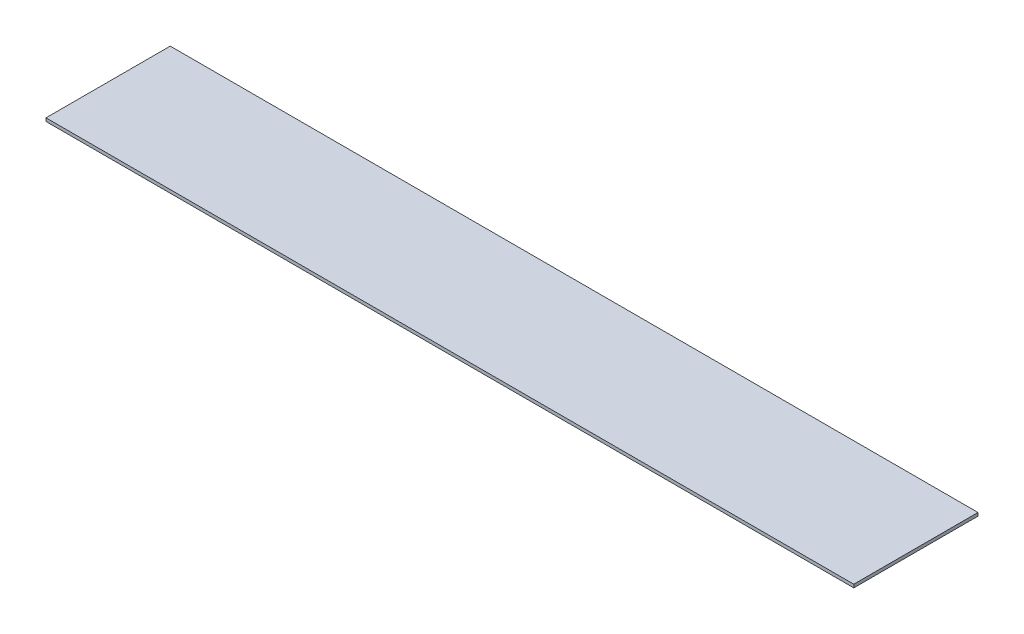
ISO-10303-21;
HEADER;
FILE_DESCRIPTION(('STEP AP214'),'2;1');
FILE_NAME('part.step','',(''),(''),'','','');
FILE_SCHEMA(('AUTOMOTIVE_DESIGN { 1 0 10303 214 1 1 1 1 }'));
ENDSEC;
DATA;
#1=APPLICATION_CONTEXT('core data for automotive mechanical design processes');
#2=APPLICATION_PROTOCOL_DEFINITION('international standard','automotive_design',2000,#1);
#3=PRODUCT_CONTEXT('',#1,'mechanical');
#4=PRODUCT('Part','Part','',(#3));
#5=PRODUCT_RELATED_PRODUCT_CATEGORY('part','',(#4));
#6=PRODUCT_DEFINITION_FORMATION('','',#4);
#7=PRODUCT_DEFINITION_CONTEXT('part definition',#1,'design');
#8=PRODUCT_DEFINITION('design','',#6,#7);
#9=PRODUCT_DEFINITION_SHAPE('','',#8);
#10=(LENGTH_UNIT() NAMED_UNIT(*) SI_UNIT(.MILLI.,.METRE.));
#11=(NAMED_UNIT(*) PLANE_ANGLE_UNIT() SI_UNIT($,.RADIAN.));
#12=(NAMED_UNIT(*) SI_UNIT($,.STERADIAN.) SOLID_ANGLE_UNIT());
#13=UNCERTAINTY_MEASURE_WITH_UNIT(LENGTH_MEASURE(1.E-05),#10,'distance_accuracy_value','');
#14=(GEOMETRIC_REPRESENTATION_CONTEXT(3) GLOBAL_UNCERTAINTY_ASSIGNED_CONTEXT((#13)) GLOBAL_UNIT_ASSIGNED_CONTEXT((#10,
#11,#12)) REPRESENTATION_CONTEXT('',''));
#15=CARTESIAN_POINT('',(0.,0.,0.));
#16=DIRECTION('',(0.,0.,1.));
#17=DIRECTION('',(1.,0.,0.));
#18=AXIS2_PLACEMENT_3D('',#15,#16,#17);
#19=CARTESIAN_POINT('',(-59.1289481870499,4.7625,-156.391847579448));
#20=DIRECTION('',(1.,0.,0.));
#21=DIRECTION('',(0.,0.,-1.));
#22=AXIS2_PLACEMENT_3D('',#19,#20,#21);
#23=PLANE('',#22);
#24=DIRECTION('',(0.,0.,1.));
#25=VECTOR('',#24,1.);
#26=CARTESIAN_POINT('',(-59.1289481870499,0.,-156.391847579448));
#27=LINE('',#26,#25);
#28=CARTESIAN_POINT('',(-59.1289481870499,0.,-156.391847579448));
#29=VERTEX_POINT('',#28);
#30=CARTESIAN_POINT('',(-59.1289481870498,0.,28.4005184205515));
#31=VERTEX_POINT('',#30);
#32=EDGE_CURVE('E98',#29,#31,#27,.T.);
#33=ORIENTED_EDGE('',*,*,#32,.T.);
#34=DIRECTION('',(0.,-1.,0.));
#35=VECTOR('',#34,1.);
#36=CARTESIAN_POINT('',(-59.1289481870498,4.7625,28.4005184205515));
#37=LINE('',#36,#35);
#38=CARTESIAN_POINT('',(-59.1289481870498,4.7625,28.4005184205515));
#39=VERTEX_POINT('',#38);
#40=EDGE_CURVE('E11',#39,#31,#37,.T.);
#41=ORIENTED_EDGE('',*,*,#40,.F.);
#42=DIRECTION('',(0.,0.,1.));
#43=VECTOR('',#42,1.);
#44=CARTESIAN_POINT('',(-59.1289481870499,4.7625,-156.391847579448));
#45=LINE('',#44,#43);
#46=CARTESIAN_POINT('',(-59.1289481870499,4.7625,-156.391847579448));
#47=VERTEX_POINT('',#46);
#48=EDGE_CURVE('E86',#47,#39,#45,.T.);
#49=ORIENTED_EDGE('',*,*,#48,.F.);
#50=DIRECTION('',(0.,-1.,0.));
#51=VECTOR('',#50,1.);
#52=CARTESIAN_POINT('',(-59.1289481870499,4.7625,-156.391847579448));
#53=LINE('',#52,#51);
#54=EDGE_CURVE('E94',#47,#29,#53,.T.);
#55=ORIENTED_EDGE('',*,*,#54,.T.);
#56=EDGE_LOOP('',(#33,#41,#49,#55));
#57=FACE_BOUND('',#56,.T.);
#58=ADVANCED_FACE('F35',(#57),#23,.F.);
#59=CARTESIAN_POINT('',(-59.1289481870498,4.7625,28.4005184205515));
#60=DIRECTION('',(0.,0.,-1.));
#61=DIRECTION('',(-1.,0.,0.));
#62=AXIS2_PLACEMENT_3D('',#59,#60,#61);
#63=PLANE('',#62);
#64=DIRECTION('',(1.,0.,0.));
#65=VECTOR('',#64,1.);
#66=CARTESIAN_POINT('',(-59.1289481870498,0.,28.4005184205515));
#67=LINE('',#66,#65);
#68=CARTESIAN_POINT('',(1142.54505181295,0.,28.4005184205515));
#69=VERTEX_POINT('',#68);
#70=EDGE_CURVE('E90',#31,#69,#67,.T.);
#71=ORIENTED_EDGE('',*,*,#70,.T.);
#72=DIRECTION('',(0.,-1.,0.));
#73=VECTOR('',#72,1.);
#74=CARTESIAN_POINT('',(1142.54505181295,4.7625,28.4005184205515));
#75=LINE('',#74,#73);
#76=CARTESIAN_POINT('',(1142.54505181295,4.7625,28.4005184205515));
#77=VERTEX_POINT('',#76);
#78=EDGE_CURVE('E43',#77,#69,#75,.T.);
#79=ORIENTED_EDGE('',*,*,#78,.F.);
#80=DIRECTION('',(1.,0.,0.));
#81=VECTOR('',#80,1.);
#82=CARTESIAN_POINT('',(-59.1289481870498,4.7625,28.4005184205515));
#83=LINE('',#82,#81);
#84=EDGE_CURVE('E81',#39,#77,#83,.T.);
#85=ORIENTED_EDGE('',*,*,#84,.F.);
#86=ORIENTED_EDGE('',*,*,#40,.T.);
#87=EDGE_LOOP('',(#71,#79,#85,#86));
#88=FACE_BOUND('',#87,.T.);
#89=ADVANCED_FACE('F89',(#88),#63,.F.);
#90=CARTESIAN_POINT('',(1142.54505181295,4.7625,-156.391847579448));
#91=DIRECTION('',(-1.,0.,0.));
#92=DIRECTION('',(0.,0.,1.));
#93=AXIS2_PLACEMENT_3D('',#90,#91,#92);
#94=PLANE('',#93);
#95=DIRECTION('',(0.,0.,-1.));
#96=VECTOR('',#95,1.);
#97=CARTESIAN_POINT('',(1142.54505181295,0.,-156.391847579448));
#98=LINE('',#97,#96);
#99=CARTESIAN_POINT('',(1142.54505181295,0.,-156.391847579448));
#100=VERTEX_POINT('',#99);
#101=EDGE_CURVE('E68',#69,#100,#98,.T.);
#102=ORIENTED_EDGE('',*,*,#101,.T.);
#103=DIRECTION('',(0.,-1.,0.));
#104=VECTOR('',#103,1.);
#105=CARTESIAN_POINT('',(1142.54505181295,4.7625,-156.391847579448));
#106=LINE('',#105,#104);
#107=CARTESIAN_POINT('',(1142.54505181295,4.7625,-156.391847579448));
#108=VERTEX_POINT('',#107);
#109=EDGE_CURVE('E91',#108,#100,#106,.T.);
#110=ORIENTED_EDGE('',*,*,#109,.F.);
#111=DIRECTION('',(0.,0.,-1.));
#112=VECTOR('',#111,1.);
#113=CARTESIAN_POINT('',(1142.54505181295,4.7625,-156.391847579448));
#114=LINE('',#113,#112);
#115=EDGE_CURVE('E84',#77,#108,#114,.T.);
#116=ORIENTED_EDGE('',*,*,#115,.F.);
#117=ORIENTED_EDGE('',*,*,#78,.T.);
#118=EDGE_LOOP('',(#102,#110,#116,#117));
#119=FACE_BOUND('',#118,.T.);
#120=ADVANCED_FACE('F92',(#119),#94,.F.);
#121=CARTESIAN_POINT('',(-59.1289481870499,4.7625,-156.391847579448));
#122=DIRECTION('',(0.,0.,1.));
#123=DIRECTION('',(1.,0.,0.));
#124=AXIS2_PLACEMENT_3D('',#121,#122,#123);
#125=PLANE('',#124);
#126=DIRECTION('',(-1.,0.,0.));
#127=VECTOR('',#126,1.);
#128=CARTESIAN_POINT('',(-59.1289481870499,0.,-156.391847579448));
#129=LINE('',#128,#127);
#130=EDGE_CURVE('E74',#100,#29,#129,.T.);
#131=ORIENTED_EDGE('',*,*,#130,.T.);
#132=ORIENTED_EDGE('',*,*,#54,.F.);
#133=DIRECTION('',(-1.,0.,0.));
#134=VECTOR('',#133,1.);
#135=CARTESIAN_POINT('',(-59.1289481870499,4.7625,-156.391847579448));
#136=LINE('',#135,#134);
#137=EDGE_CURVE('E51',#108,#47,#136,.T.);
#138=ORIENTED_EDGE('',*,*,#137,.F.);
#139=ORIENTED_EDGE('',*,*,#109,.T.);
#140=EDGE_LOOP('',(#131,#132,#138,#139));
#141=FACE_BOUND('',#140,.T.);
#142=ADVANCED_FACE('F105',(#141),#125,.F.);
#143=CARTESIAN_POINT('',(0.,4.7625,0.));
#144=DIRECTION('',(0.,1.,0.));
#145=DIRECTION('',(0.,0.,1.));
#146=AXIS2_PLACEMENT_3D('',#143,#144,#145);
#147=PLANE('',#146);
#148=ORIENTED_EDGE('',*,*,#48,.T.);
#149=ORIENTED_EDGE('',*,*,#84,.T.);
#150=ORIENTED_EDGE('',*,*,#115,.T.);
#151=ORIENTED_EDGE('',*,*,#137,.T.);
#152=EDGE_LOOP('',(#148,#149,#150,#151));
#153=FACE_BOUND('',#152,.T.);
#154=ADVANCED_FACE('F82',(#153),#147,.T.);
#155=CARTESIAN_POINT('',(0.,0.,0.));
#156=DIRECTION('',(0.,1.,0.));
#157=DIRECTION('',(0.,0.,1.));
#158=AXIS2_PLACEMENT_3D('',#155,#156,#157);
#159=PLANE('',#158);
#160=ORIENTED_EDGE('',*,*,#32,.F.);
#161=ORIENTED_EDGE('',*,*,#130,.F.);
#162=ORIENTED_EDGE('',*,*,#101,.F.);
#163=ORIENTED_EDGE('',*,*,#70,.F.);
#164=EDGE_LOOP('',(#160,#161,#162,#163));
#165=FACE_BOUND('',#164,.T.);
#166=ADVANCED_FACE('F108',(#165),#159,.F.);
#167=CLOSED_SHELL('',(#58,#89,#120,#142,#154,#166));
#168=MANIFOLD_SOLID_BREP('B2',#167);
#169=ADVANCED_BREP_SHAPE_REPRESENTATION('',(#18,#168),#14);
#170=SHAPE_DEFINITION_REPRESENTATION(#9,#169);
ENDSEC;
END-ISO-10303-21;
